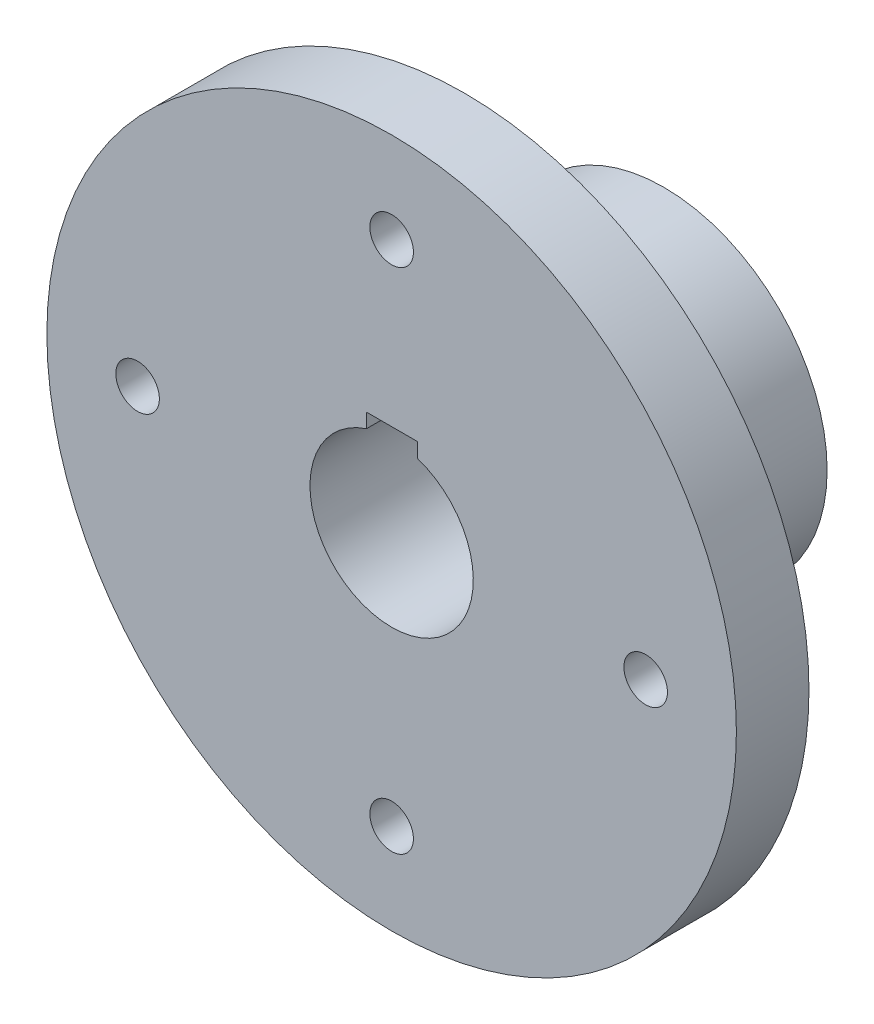
ISO-10303-21;
HEADER;
FILE_DESCRIPTION(('STEP AP214'),'2;1');
FILE_NAME('part.step','',(''),(''),'','','');
FILE_SCHEMA(('AUTOMOTIVE_DESIGN { 1 0 10303 214 1 1 1 1 }'));
ENDSEC;
DATA;
#1=APPLICATION_CONTEXT('core data for automotive mechanical design processes');
#2=APPLICATION_PROTOCOL_DEFINITION('international standard','automotive_design',2000,#1);
#3=PRODUCT_CONTEXT('',#1,'mechanical');
#4=PRODUCT('Part','Part','',(#3));
#5=PRODUCT_RELATED_PRODUCT_CATEGORY('part','',(#4));
#6=PRODUCT_DEFINITION_FORMATION('','',#4);
#7=PRODUCT_DEFINITION_CONTEXT('part definition',#1,'design');
#8=PRODUCT_DEFINITION('design','',#6,#7);
#9=PRODUCT_DEFINITION_SHAPE('','',#8);
#10=(LENGTH_UNIT() NAMED_UNIT(*) SI_UNIT(.MILLI.,.METRE.));
#11=(NAMED_UNIT(*) PLANE_ANGLE_UNIT() SI_UNIT($,.RADIAN.));
#12=(NAMED_UNIT(*) SI_UNIT($,.STERADIAN.) SOLID_ANGLE_UNIT());
#13=UNCERTAINTY_MEASURE_WITH_UNIT(LENGTH_MEASURE(1.E-05),#10,'distance_accuracy_value','');
#14=(GEOMETRIC_REPRESENTATION_CONTEXT(3) GLOBAL_UNCERTAINTY_ASSIGNED_CONTEXT((#13)) GLOBAL_UNIT_ASSIGNED_CONTEXT((#10,
#11,#12)) REPRESENTATION_CONTEXT('',''));
#15=CARTESIAN_POINT('',(0.,0.,0.));
#16=DIRECTION('',(0.,0.,1.));
#17=DIRECTION('',(1.,0.,0.));
#18=AXIS2_PLACEMENT_3D('',#15,#16,#17);
#19=CARTESIAN_POINT('',(0.,0.,20.));
#20=DIRECTION('',(0.,0.,-1.));
#21=DIRECTION('',(-1.,0.,0.));
#22=AXIS2_PLACEMENT_3D('',#19,#20,#21);
#23=CYLINDRICAL_SURFACE('',#22,95.);
#24=CARTESIAN_POINT('',(0.,0.,20.));
#25=DIRECTION('',(0.,0.,1.));
#26=DIRECTION('',(1.,0.,0.));
#27=AXIS2_PLACEMENT_3D('',#24,#25,#26);
#28=CIRCLE('',#27,95.);
#29=CARTESIAN_POINT('',(95.,0.,20.));
#30=VERTEX_POINT('',#29);
#31=EDGE_CURVE('E44',#30,#30,#28,.T.);
#32=ORIENTED_EDGE('',*,*,#31,.F.);
#33=EDGE_LOOP('',(#32));
#34=FACE_BOUND('',#33,.T.);
#35=CARTESIAN_POINT('',(0.,0.,0.));
#36=DIRECTION('',(0.,0.,1.));
#37=DIRECTION('',(1.,0.,0.));
#38=AXIS2_PLACEMENT_3D('',#35,#36,#37);
#39=CIRCLE('',#38,95.);
#40=CARTESIAN_POINT('',(95.,0.,0.));
#41=VERTEX_POINT('',#40);
#42=EDGE_CURVE('E120',#41,#41,#39,.T.);
#43=ORIENTED_EDGE('',*,*,#42,.T.);
#44=EDGE_LOOP('',(#43));
#45=FACE_BOUND('',#44,.T.);
#46=ADVANCED_FACE('F37',(#34,#45),#23,.T.);
#47=CARTESIAN_POINT('',(0.,0.,20.));
#48=DIRECTION('',(0.,0.,1.));
#49=DIRECTION('',(1.,0.,0.));
#50=AXIS2_PLACEMENT_3D('',#47,#48,#49);
#51=PLANE('',#50);
#52=CARTESIAN_POINT('',(0.,0.,20.));
#53=DIRECTION('',(0.,0.,1.));
#54=DIRECTION('',(1.,0.,0.));
#55=AXIS2_PLACEMENT_3D('',#52,#53,#54);
#56=CIRCLE('',#55,22.5);
#57=CARTESIAN_POINT('',(-6.94026599333992,21.4028668159592,20.));
#58=VERTEX_POINT('',#57);
#59=CARTESIAN_POINT('',(7.05973400666008,21.3637579970193,20.));
#60=VERTEX_POINT('',#59);
#61=EDGE_CURVE('E51',#58,#60,#56,.T.);
#62=ORIENTED_EDGE('',*,*,#61,.F.);
#63=DIRECTION('',(0.,-1.,0.));
#64=VECTOR('',#63,1.);
#65=CARTESIAN_POINT('',(-6.94026599333992,22.474071894756,20.));
#66=LINE('',#65,#64);
#67=CARTESIAN_POINT('',(-6.94026599333992,25.374071894756,20.));
#68=VERTEX_POINT('',#67);
#69=EDGE_CURVE('E95',#68,#58,#66,.T.);
#70=ORIENTED_EDGE('',*,*,#69,.F.);
#71=DIRECTION('',(-1.,0.,0.));
#72=VECTOR('',#71,1.);
#73=CARTESIAN_POINT('',(-6.94026599333992,25.374071894756,20.));
#74=LINE('',#73,#72);
#75=CARTESIAN_POINT('',(7.05973400666008,25.374071894756,20.));
#76=VERTEX_POINT('',#75);
#77=EDGE_CURVE('E98',#76,#68,#74,.T.);
#78=ORIENTED_EDGE('',*,*,#77,.F.);
#79=DIRECTION('',(0.,1.,0.));
#80=VECTOR('',#79,1.);
#81=CARTESIAN_POINT('',(7.05973400666008,25.374071894756,20.));
#82=LINE('',#81,#80);
#83=EDGE_CURVE('E104',#60,#76,#82,.T.);
#84=ORIENTED_EDGE('',*,*,#83,.F.);
#85=EDGE_LOOP('',(#62,#70,#78,#84));
#86=FACE_BOUND('',#85,.T.);
#87=CARTESIAN_POINT('',(0.,70.,20.));
#88=DIRECTION('',(0.,0.,1.));
#89=DIRECTION('',(1.,0.,0.));
#90=AXIS2_PLACEMENT_3D('',#87,#88,#89);
#91=CIRCLE('',#90,6.);
#92=CARTESIAN_POINT('',(6.,70.,20.));
#93=VERTEX_POINT('',#92);
#94=EDGE_CURVE('E121',#93,#93,#91,.T.);
#95=ORIENTED_EDGE('',*,*,#94,.F.);
#96=EDGE_LOOP('',(#95));
#97=FACE_BOUND('',#96,.T.);
#98=CARTESIAN_POINT('',(70.,0.,20.));
#99=DIRECTION('',(0.,0.,1.));
#100=DIRECTION('',(1.,0.,0.));
#101=AXIS2_PLACEMENT_3D('',#98,#99,#100);
#102=CIRCLE('',#101,6.);
#103=CARTESIAN_POINT('',(76.,0.,20.));
#104=VERTEX_POINT('',#103);
#105=EDGE_CURVE('E124',#104,#104,#102,.T.);
#106=ORIENTED_EDGE('',*,*,#105,.F.);
#107=EDGE_LOOP('',(#106));
#108=FACE_BOUND('',#107,.T.);
#109=CARTESIAN_POINT('',(0.,-70.,20.));
#110=DIRECTION('',(0.,0.,1.));
#111=DIRECTION('',(-1.,0.,0.));
#112=AXIS2_PLACEMENT_3D('',#109,#110,#111);
#113=CIRCLE('',#112,6.);
#114=CARTESIAN_POINT('',(-6.00000000000001,-70.,20.));
#115=VERTEX_POINT('',#114);
#116=EDGE_CURVE('E130',#115,#115,#113,.T.);
#117=ORIENTED_EDGE('',*,*,#116,.F.);
#118=EDGE_LOOP('',(#117));
#119=FACE_BOUND('',#118,.T.);
#120=CARTESIAN_POINT('',(-70.,0.,20.));
#121=DIRECTION('',(0.,0.,1.));
#122=DIRECTION('',(-1.,0.,0.));
#123=AXIS2_PLACEMENT_3D('',#120,#121,#122);
#124=CIRCLE('',#123,6.);
#125=CARTESIAN_POINT('',(-76.,0.,20.));
#126=VERTEX_POINT('',#125);
#127=EDGE_CURVE('E136',#126,#126,#124,.T.);
#128=ORIENTED_EDGE('',*,*,#127,.F.);
#129=EDGE_LOOP('',(#128));
#130=FACE_BOUND('',#129,.T.);
#131=ORIENTED_EDGE('',*,*,#31,.T.);
#132=EDGE_LOOP('',(#131));
#133=FACE_BOUND('',#132,.T.);
#134=ADVANCED_FACE('F149',(#86,#97,#108,#119,#130,#133),#51,.T.);
#135=CARTESIAN_POINT('',(0.,0.,0.));
#136=DIRECTION('',(0.,0.,1.));
#137=DIRECTION('',(1.,0.,0.));
#138=AXIS2_PLACEMENT_3D('',#135,#136,#137);
#139=PLANE('',#138);
#140=CARTESIAN_POINT('',(0.,0.,0.));
#141=DIRECTION('',(0.,0.,1.));
#142=DIRECTION('',(1.,0.,0.));
#143=AXIS2_PLACEMENT_3D('',#140,#141,#142);
#144=CIRCLE('',#143,45.);
#145=CARTESIAN_POINT('',(45.,0.,0.));
#146=VERTEX_POINT('',#145);
#147=EDGE_CURVE('E11',#146,#146,#144,.F.);
#148=ORIENTED_EDGE('',*,*,#147,.F.);
#149=EDGE_LOOP('',(#148));
#150=FACE_BOUND('',#149,.T.);
#151=CARTESIAN_POINT('',(0.,70.,0.));
#152=DIRECTION('',(0.,0.,1.));
#153=DIRECTION('',(1.,0.,0.));
#154=AXIS2_PLACEMENT_3D('',#151,#152,#153);
#155=CIRCLE('',#154,6.);
#156=CARTESIAN_POINT('',(6.,70.,0.));
#157=VERTEX_POINT('',#156);
#158=EDGE_CURVE('E117',#157,#157,#155,.T.);
#159=ORIENTED_EDGE('',*,*,#158,.T.);
#160=EDGE_LOOP('',(#159));
#161=FACE_BOUND('',#160,.T.);
#162=CARTESIAN_POINT('',(70.,0.,0.));
#163=DIRECTION('',(0.,0.,1.));
#164=DIRECTION('',(1.,0.,0.));
#165=AXIS2_PLACEMENT_3D('',#162,#163,#164);
#166=CIRCLE('',#165,6.);
#167=CARTESIAN_POINT('',(76.,0.,0.));
#168=VERTEX_POINT('',#167);
#169=EDGE_CURVE('E127',#168,#168,#166,.T.);
#170=ORIENTED_EDGE('',*,*,#169,.T.);
#171=EDGE_LOOP('',(#170));
#172=FACE_BOUND('',#171,.T.);
#173=CARTESIAN_POINT('',(0.,-70.,0.));
#174=DIRECTION('',(0.,0.,1.));
#175=DIRECTION('',(-1.,0.,0.));
#176=AXIS2_PLACEMENT_3D('',#173,#174,#175);
#177=CIRCLE('',#176,6.);
#178=CARTESIAN_POINT('',(-6.00000000000001,-70.,0.));
#179=VERTEX_POINT('',#178);
#180=EDGE_CURVE('E133',#179,#179,#177,.T.);
#181=ORIENTED_EDGE('',*,*,#180,.T.);
#182=EDGE_LOOP('',(#181));
#183=FACE_BOUND('',#182,.T.);
#184=CARTESIAN_POINT('',(-70.,0.,0.));
#185=DIRECTION('',(0.,0.,1.));
#186=DIRECTION('',(-1.,0.,0.));
#187=AXIS2_PLACEMENT_3D('',#184,#185,#186);
#188=CIRCLE('',#187,6.);
#189=CARTESIAN_POINT('',(-76.,0.,0.));
#190=VERTEX_POINT('',#189);
#191=EDGE_CURVE('E116',#190,#190,#188,.T.);
#192=ORIENTED_EDGE('',*,*,#191,.T.);
#193=EDGE_LOOP('',(#192));
#194=FACE_BOUND('',#193,.T.);
#195=ORIENTED_EDGE('',*,*,#42,.F.);
#196=EDGE_LOOP('',(#195));
#197=FACE_BOUND('',#196,.T.);
#198=ADVANCED_FACE('F146',(#150,#161,#172,#183,#194,#197),#139,.F.);
#199=CARTESIAN_POINT('',(-70.,0.,0.));
#200=DIRECTION('',(0.,0.,1.));
#201=DIRECTION('',(1.,0.,0.));
#202=AXIS2_PLACEMENT_3D('',#199,#200,#201);
#203=CYLINDRICAL_SURFACE('',#202,6.);
#204=ORIENTED_EDGE('',*,*,#191,.F.);
#205=EDGE_LOOP('',(#204));
#206=FACE_BOUND('',#205,.T.);
#207=ORIENTED_EDGE('',*,*,#127,.T.);
#208=EDGE_LOOP('',(#207));
#209=FACE_BOUND('',#208,.T.);
#210=ADVANCED_FACE('F148',(#206,#209),#203,.F.);
#211=CARTESIAN_POINT('',(0.,-70.,0.));
#212=DIRECTION('',(0.,0.,1.));
#213=DIRECTION('',(1.,0.,0.));
#214=AXIS2_PLACEMENT_3D('',#211,#212,#213);
#215=CYLINDRICAL_SURFACE('',#214,6.);
#216=ORIENTED_EDGE('',*,*,#180,.F.);
#217=EDGE_LOOP('',(#216));
#218=FACE_BOUND('',#217,.T.);
#219=ORIENTED_EDGE('',*,*,#116,.T.);
#220=EDGE_LOOP('',(#219));
#221=FACE_BOUND('',#220,.T.);
#222=ADVANCED_FACE('F155',(#218,#221),#215,.F.);
#223=CARTESIAN_POINT('',(70.,0.,0.));
#224=DIRECTION('',(0.,0.,1.));
#225=DIRECTION('',(1.,0.,0.));
#226=AXIS2_PLACEMENT_3D('',#223,#224,#225);
#227=CYLINDRICAL_SURFACE('',#226,6.);
#228=ORIENTED_EDGE('',*,*,#169,.F.);
#229=EDGE_LOOP('',(#228));
#230=FACE_BOUND('',#229,.T.);
#231=ORIENTED_EDGE('',*,*,#105,.T.);
#232=EDGE_LOOP('',(#231));
#233=FACE_BOUND('',#232,.T.);
#234=ADVANCED_FACE('F255',(#230,#233),#227,.F.);
#235=CARTESIAN_POINT('',(0.,70.,0.));
#236=DIRECTION('',(0.,0.,1.));
#237=DIRECTION('',(1.,0.,0.));
#238=AXIS2_PLACEMENT_3D('',#235,#236,#237);
#239=CYLINDRICAL_SURFACE('',#238,6.);
#240=ORIENTED_EDGE('',*,*,#158,.F.);
#241=EDGE_LOOP('',(#240));
#242=FACE_BOUND('',#241,.T.);
#243=ORIENTED_EDGE('',*,*,#94,.T.);
#244=EDGE_LOOP('',(#243));
#245=FACE_BOUND('',#244,.T.);
#246=ADVANCED_FACE('F246',(#242,#245),#239,.F.);
#247=CARTESIAN_POINT('',(0.,0.,-55.));
#248=DIRECTION('',(0.,0.,1.));
#249=DIRECTION('',(1.,0.,0.));
#250=AXIS2_PLACEMENT_3D('',#247,#248,#249);
#251=CYLINDRICAL_SURFACE('',#250,45.);
#252=CARTESIAN_POINT('',(0.,0.,-55.));
#253=DIRECTION('',(0.,0.,-1.));
#254=DIRECTION('',(-1.,0.,0.));
#255=AXIS2_PLACEMENT_3D('',#252,#253,#254);
#256=CIRCLE('',#255,45.);
#257=CARTESIAN_POINT('',(-45.,0.,-55.));
#258=VERTEX_POINT('',#257);
#259=EDGE_CURVE('E110',#258,#258,#256,.T.);
#260=ORIENTED_EDGE('',*,*,#259,.F.);
#261=EDGE_LOOP('',(#260));
#262=FACE_BOUND('',#261,.T.);
#263=ORIENTED_EDGE('',*,*,#147,.T.);
#264=EDGE_LOOP('',(#263));
#265=FACE_BOUND('',#264,.T.);
#266=ADVANCED_FACE('F181',(#262,#265),#251,.T.);
#267=CARTESIAN_POINT('',(0.,0.,-55.));
#268=DIRECTION('',(0.,0.,-1.));
#269=DIRECTION('',(-1.,0.,0.));
#270=AXIS2_PLACEMENT_3D('',#267,#268,#269);
#271=PLANE('',#270);
#272=CARTESIAN_POINT('',(0.,0.,-55.));
#273=DIRECTION('',(0.,0.,1.));
#274=DIRECTION('',(1.,0.,0.));
#275=AXIS2_PLACEMENT_3D('',#272,#273,#274);
#276=CIRCLE('',#275,22.5);
#277=CARTESIAN_POINT('',(-6.94026599333992,21.4028668159592,-55.));
#278=VERTEX_POINT('',#277);
#279=CARTESIAN_POINT('',(7.05973400666008,21.3637579970193,-55.));
#280=VERTEX_POINT('',#279);
#281=EDGE_CURVE('E79',#278,#280,#276,.T.);
#282=ORIENTED_EDGE('',*,*,#281,.T.);
#283=DIRECTION('',(0.,1.,0.));
#284=VECTOR('',#283,1.);
#285=CARTESIAN_POINT('',(7.05973400666008,22.474071894756,-55.));
#286=LINE('',#285,#284);
#287=CARTESIAN_POINT('',(7.05973400666008,25.374071894756,-55.));
#288=VERTEX_POINT('',#287);
#289=EDGE_CURVE('E88',#280,#288,#286,.T.);
#290=ORIENTED_EDGE('',*,*,#289,.T.);
#291=DIRECTION('',(-1.,0.,0.));
#292=VECTOR('',#291,1.);
#293=CARTESIAN_POINT('',(-6.94026599333992,25.374071894756,-55.));
#294=LINE('',#293,#292);
#295=CARTESIAN_POINT('',(-6.94026599333992,25.374071894756,-55.));
#296=VERTEX_POINT('',#295);
#297=EDGE_CURVE('E59',#288,#296,#294,.T.);
#298=ORIENTED_EDGE('',*,*,#297,.T.);
#299=DIRECTION('',(0.,-1.,0.));
#300=VECTOR('',#299,1.);
#301=CARTESIAN_POINT('',(-6.94026599333992,25.374071894756,-55.));
#302=LINE('',#301,#300);
#303=EDGE_CURVE('E85',#296,#278,#302,.T.);
#304=ORIENTED_EDGE('',*,*,#303,.T.);
#305=EDGE_LOOP('',(#282,#290,#298,#304));
#306=FACE_BOUND('',#305,.T.);
#307=ORIENTED_EDGE('',*,*,#259,.T.);
#308=EDGE_LOOP('',(#307));
#309=FACE_BOUND('',#308,.T.);
#310=ADVANCED_FACE('F92',(#306,#309),#271,.T.);
#311=CARTESIAN_POINT('',(0.,0.,-55.));
#312=DIRECTION('',(0.,0.,1.));
#313=DIRECTION('',(1.,0.,0.));
#314=AXIS2_PLACEMENT_3D('',#311,#312,#313);
#315=CYLINDRICAL_SURFACE('',#314,22.5);
#316=ORIENTED_EDGE('',*,*,#61,.T.);
#317=DIRECTION('',(0.,0.,1.));
#318=VECTOR('',#317,1.);
#319=CARTESIAN_POINT('',(7.05973400666008,21.3637579970193,-55.));
#320=LINE('',#319,#318);
#321=EDGE_CURVE('E75',#280,#60,#320,.T.);
#322=ORIENTED_EDGE('',*,*,#321,.F.);
#323=ORIENTED_EDGE('',*,*,#281,.F.);
#324=DIRECTION('',(0.,0.,1.));
#325=VECTOR('',#324,1.);
#326=CARTESIAN_POINT('',(-6.94026599333992,21.4028668159592,-55.));
#327=LINE('',#326,#325);
#328=EDGE_CURVE('E108',#278,#58,#327,.T.);
#329=ORIENTED_EDGE('',*,*,#328,.T.);
#330=EDGE_LOOP('',(#316,#322,#323,#329));
#331=FACE_BOUND('',#330,.T.);
#332=ADVANCED_FACE('F77',(#331),#315,.F.);
#333=CARTESIAN_POINT('',(-6.94026599333992,22.474071894756,-55.));
#334=DIRECTION('',(-1.,0.,0.));
#335=DIRECTION('',(0.,0.,1.));
#336=AXIS2_PLACEMENT_3D('',#333,#334,#335);
#337=PLANE('',#336);
#338=ORIENTED_EDGE('',*,*,#69,.T.);
#339=ORIENTED_EDGE('',*,*,#328,.F.);
#340=ORIENTED_EDGE('',*,*,#303,.F.);
#341=DIRECTION('',(0.,0.,1.));
#342=VECTOR('',#341,1.);
#343=CARTESIAN_POINT('',(-6.94026599333992,25.374071894756,-55.));
#344=LINE('',#343,#342);
#345=EDGE_CURVE('E111',#296,#68,#344,.T.);
#346=ORIENTED_EDGE('',*,*,#345,.T.);
#347=EDGE_LOOP('',(#338,#339,#340,#346));
#348=FACE_BOUND('',#347,.T.);
#349=ADVANCED_FACE('F198',(#348),#337,.F.);
#350=CARTESIAN_POINT('',(-6.94026599333992,25.374071894756,-55.));
#351=DIRECTION('',(0.,1.,0.));
#352=DIRECTION('',(0.,0.,1.));
#353=AXIS2_PLACEMENT_3D('',#350,#351,#352);
#354=PLANE('',#353);
#355=ORIENTED_EDGE('',*,*,#77,.T.);
#356=ORIENTED_EDGE('',*,*,#345,.F.);
#357=ORIENTED_EDGE('',*,*,#297,.F.);
#358=DIRECTION('',(0.,0.,1.));
#359=VECTOR('',#358,1.);
#360=CARTESIAN_POINT('',(7.05973400666008,25.374071894756,-55.));
#361=LINE('',#360,#359);
#362=EDGE_CURVE('E84',#288,#76,#361,.T.);
#363=ORIENTED_EDGE('',*,*,#362,.T.);
#364=EDGE_LOOP('',(#355,#356,#357,#363));
#365=FACE_BOUND('',#364,.T.);
#366=ADVANCED_FACE('F209',(#365),#354,.F.);
#367=CARTESIAN_POINT('',(7.05973400666008,25.374071894756,-55.));
#368=DIRECTION('',(1.,0.,0.));
#369=DIRECTION('',(0.,0.,-1.));
#370=AXIS2_PLACEMENT_3D('',#367,#368,#369);
#371=PLANE('',#370);
#372=ORIENTED_EDGE('',*,*,#83,.T.);
#373=ORIENTED_EDGE('',*,*,#362,.F.);
#374=ORIENTED_EDGE('',*,*,#289,.F.);
#375=ORIENTED_EDGE('',*,*,#321,.T.);
#376=EDGE_LOOP('',(#372,#373,#374,#375));
#377=FACE_BOUND('',#376,.T.);
#378=ADVANCED_FACE('F89',(#377),#371,.F.);
#379=CLOSED_SHELL('',(#46,#134,#198,#210,#222,#234,#246,#266,#310,#332,#349,#366,#378));
#380=MANIFOLD_SOLID_BREP('B2',#379);
#381=ADVANCED_BREP_SHAPE_REPRESENTATION('',(#18,#380),#14);
#382=SHAPE_DEFINITION_REPRESENTATION(#9,#381);
ENDSEC;
END-ISO-10303-21;
